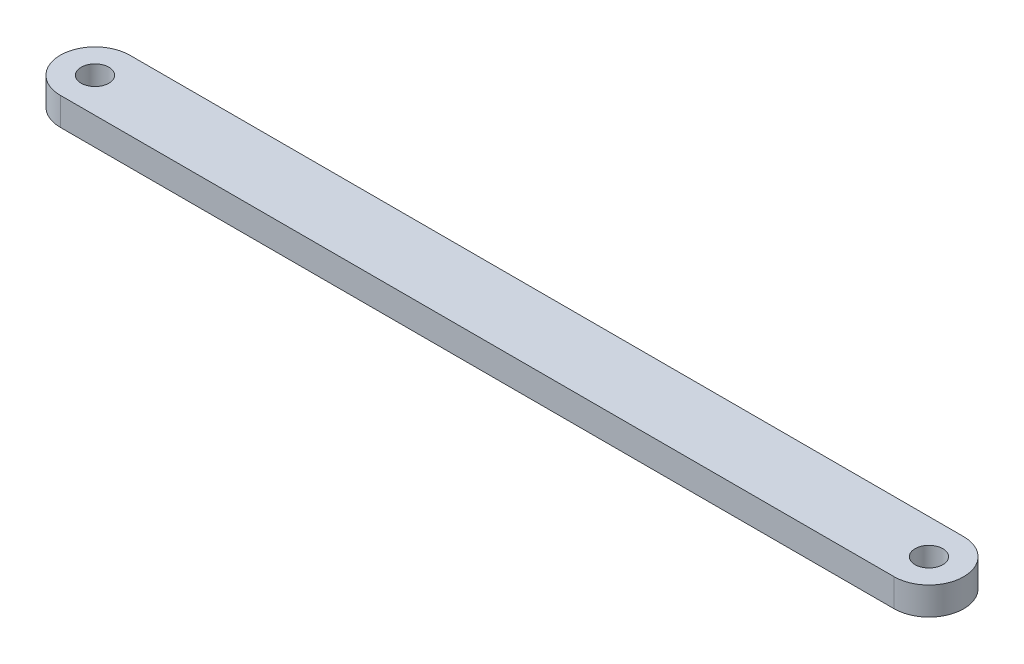
ISO-10303-21;
HEADER;
FILE_DESCRIPTION(('STEP AP214'),'2;1');
FILE_NAME('part.step','',(''),(''),'','','');
FILE_SCHEMA(('AUTOMOTIVE_DESIGN { 1 0 10303 214 1 1 1 1 }'));
ENDSEC;
DATA;
#1=APPLICATION_CONTEXT('core data for automotive mechanical design processes');
#2=APPLICATION_PROTOCOL_DEFINITION('international standard','automotive_design',2000,#1);
#3=PRODUCT_CONTEXT('',#1,'mechanical');
#4=PRODUCT('Part','Part','',(#3));
#5=PRODUCT_RELATED_PRODUCT_CATEGORY('part','',(#4));
#6=PRODUCT_DEFINITION_FORMATION('','',#4);
#7=PRODUCT_DEFINITION_CONTEXT('part definition',#1,'design');
#8=PRODUCT_DEFINITION('design','',#6,#7);
#9=PRODUCT_DEFINITION_SHAPE('','',#8);
#10=(LENGTH_UNIT() NAMED_UNIT(*) SI_UNIT(.MILLI.,.METRE.));
#11=(NAMED_UNIT(*) PLANE_ANGLE_UNIT() SI_UNIT($,.RADIAN.));
#12=(NAMED_UNIT(*) SI_UNIT($,.STERADIAN.) SOLID_ANGLE_UNIT());
#13=UNCERTAINTY_MEASURE_WITH_UNIT(LENGTH_MEASURE(1.E-05),#10,'distance_accuracy_value','');
#14=(GEOMETRIC_REPRESENTATION_CONTEXT(3) GLOBAL_UNCERTAINTY_ASSIGNED_CONTEXT((#13)) GLOBAL_UNIT_ASSIGNED_CONTEXT((#10,
#11,#12)) REPRESENTATION_CONTEXT('',''));
#15=CARTESIAN_POINT('',(0.,0.,0.));
#16=DIRECTION('',(0.,0.,1.));
#17=DIRECTION('',(1.,0.,0.));
#18=AXIS2_PLACEMENT_3D('',#15,#16,#17);
#19=CARTESIAN_POINT('',(-10.,2.,0.));
#20=DIRECTION('',(0.,1.,0.));
#21=DIRECTION('',(0.,0.,1.));
#22=AXIS2_PLACEMENT_3D('',#19,#20,#21);
#23=PLANE('',#22);
#24=CARTESIAN_POINT('',(50.,2.,0.));
#25=DIRECTION('',(0.,1.,0.));
#26=DIRECTION('',(0.,0.,1.));
#27=AXIS2_PLACEMENT_3D('',#24,#25,#26);
#28=CIRCLE('',#27,0.999999999999998);
#29=CARTESIAN_POINT('',(50.,2.,0.999999999999998));
#30=VERTEX_POINT('',#29);
#31=EDGE_CURVE('E104',#30,#30,#28,.T.);
#32=ORIENTED_EDGE('',*,*,#31,.F.);
#33=EDGE_LOOP('',(#32));
#34=FACE_BOUND('',#33,.T.);
#35=CARTESIAN_POINT('',(-10.,2.,0.));
#36=DIRECTION('',(0.,1.,0.));
#37=DIRECTION('',(0.,0.,1.));
#38=AXIS2_PLACEMENT_3D('',#35,#36,#37);
#39=CIRCLE('',#38,2.5);
#40=CARTESIAN_POINT('',(-10.,2.,-2.5));
#41=VERTEX_POINT('',#40);
#42=CARTESIAN_POINT('',(-10.,2.,2.5));
#43=VERTEX_POINT('',#42);
#44=EDGE_CURVE('E89',#41,#43,#39,.T.);
#45=ORIENTED_EDGE('',*,*,#44,.T.);
#46=DIRECTION('',(1.,0.,0.));
#47=VECTOR('',#46,1.);
#48=CARTESIAN_POINT('',(-10.,2.,2.5));
#49=LINE('',#48,#47);
#50=CARTESIAN_POINT('',(50.,2.,2.5));
#51=VERTEX_POINT('',#50);
#52=EDGE_CURVE('E84',#43,#51,#49,.T.);
#53=ORIENTED_EDGE('',*,*,#52,.T.);
#54=CARTESIAN_POINT('',(50.,2.,0.));
#55=DIRECTION('',(0.,1.,0.));
#56=DIRECTION('',(0.,0.,1.));
#57=AXIS2_PLACEMENT_3D('',#54,#55,#56);
#58=CIRCLE('',#57,2.5);
#59=CARTESIAN_POINT('',(50.,2.,-2.5));
#60=VERTEX_POINT('',#59);
#61=EDGE_CURVE('E87',#51,#60,#58,.T.);
#62=ORIENTED_EDGE('',*,*,#61,.T.);
#63=DIRECTION('',(-1.,0.,0.));
#64=VECTOR('',#63,1.);
#65=CARTESIAN_POINT('',(-10.,2.,-2.5));
#66=LINE('',#65,#64);
#67=EDGE_CURVE('E54',#60,#41,#66,.T.);
#68=ORIENTED_EDGE('',*,*,#67,.T.);
#69=EDGE_LOOP('',(#45,#53,#62,#68));
#70=FACE_BOUND('',#69,.T.);
#71=CARTESIAN_POINT('',(-10.,2.,0.));
#72=DIRECTION('',(0.,1.,0.));
#73=DIRECTION('',(0.,0.,1.));
#74=AXIS2_PLACEMENT_3D('',#71,#72,#73);
#75=CIRCLE('',#74,1.);
#76=CARTESIAN_POINT('',(-10.,2.,1.));
#77=VERTEX_POINT('',#76);
#78=EDGE_CURVE('E119',#77,#77,#75,.T.);
#79=ORIENTED_EDGE('',*,*,#78,.F.);
#80=EDGE_LOOP('',(#79));
#81=FACE_BOUND('',#80,.T.);
#82=ADVANCED_FACE('F37',(#34,#70,#81),#23,.T.);
#83=CARTESIAN_POINT('',(-10.,0.,0.));
#84=DIRECTION('',(0.,1.,0.));
#85=DIRECTION('',(0.,0.,1.));
#86=AXIS2_PLACEMENT_3D('',#83,#84,#85);
#87=PLANE('',#86);
#88=CARTESIAN_POINT('',(-10.,0.,0.));
#89=DIRECTION('',(0.,1.,0.));
#90=DIRECTION('',(0.,0.,1.));
#91=AXIS2_PLACEMENT_3D('',#88,#89,#90);
#92=CIRCLE('',#91,2.5);
#93=CARTESIAN_POINT('',(-10.,0.,-2.5));
#94=VERTEX_POINT('',#93);
#95=CARTESIAN_POINT('',(-10.,0.,2.5));
#96=VERTEX_POINT('',#95);
#97=EDGE_CURVE('E101',#94,#96,#92,.T.);
#98=ORIENTED_EDGE('',*,*,#97,.F.);
#99=DIRECTION('',(-1.,0.,0.));
#100=VECTOR('',#99,1.);
#101=CARTESIAN_POINT('',(-10.,0.,-2.5));
#102=LINE('',#101,#100);
#103=CARTESIAN_POINT('',(50.,0.,-2.5));
#104=VERTEX_POINT('',#103);
#105=EDGE_CURVE('E77',#104,#94,#102,.T.);
#106=ORIENTED_EDGE('',*,*,#105,.F.);
#107=CARTESIAN_POINT('',(50.,0.,0.));
#108=DIRECTION('',(0.,1.,0.));
#109=DIRECTION('',(0.,0.,1.));
#110=AXIS2_PLACEMENT_3D('',#107,#108,#109);
#111=CIRCLE('',#110,2.5);
#112=CARTESIAN_POINT('',(50.,0.,2.5));
#113=VERTEX_POINT('',#112);
#114=EDGE_CURVE('E71',#113,#104,#111,.T.);
#115=ORIENTED_EDGE('',*,*,#114,.F.);
#116=DIRECTION('',(1.,0.,0.));
#117=VECTOR('',#116,1.);
#118=CARTESIAN_POINT('',(-10.,0.,2.5));
#119=LINE('',#118,#117);
#120=EDGE_CURVE('E93',#96,#113,#119,.T.);
#121=ORIENTED_EDGE('',*,*,#120,.F.);
#122=EDGE_LOOP('',(#98,#106,#115,#121));
#123=FACE_BOUND('',#122,.T.);
#124=CARTESIAN_POINT('',(50.,0.,0.));
#125=DIRECTION('',(0.,1.,0.));
#126=DIRECTION('',(0.,0.,1.));
#127=AXIS2_PLACEMENT_3D('',#124,#125,#126);
#128=CIRCLE('',#127,0.999999999999998);
#129=CARTESIAN_POINT('',(50.,0.,0.999999999999998));
#130=VERTEX_POINT('',#129);
#131=EDGE_CURVE('E116',#130,#130,#128,.T.);
#132=ORIENTED_EDGE('',*,*,#131,.T.);
#133=EDGE_LOOP('',(#132));
#134=FACE_BOUND('',#133,.T.);
#135=CARTESIAN_POINT('',(-10.,0.,0.));
#136=DIRECTION('',(0.,1.,0.));
#137=DIRECTION('',(0.,0.,1.));
#138=AXIS2_PLACEMENT_3D('',#135,#136,#137);
#139=CIRCLE('',#138,1.);
#140=CARTESIAN_POINT('',(-10.,0.,1.));
#141=VERTEX_POINT('',#140);
#142=EDGE_CURVE('E122',#141,#141,#139,.T.);
#143=ORIENTED_EDGE('',*,*,#142,.T.);
#144=EDGE_LOOP('',(#143));
#145=FACE_BOUND('',#144,.T.);
#146=ADVANCED_FACE('F112',(#123,#134,#145),#87,.F.);
#147=CARTESIAN_POINT('',(-10.,2.,0.));
#148=DIRECTION('',(0.,-1.,0.));
#149=DIRECTION('',(0.,0.,-1.));
#150=AXIS2_PLACEMENT_3D('',#147,#148,#149);
#151=CYLINDRICAL_SURFACE('',#150,2.5);
#152=ORIENTED_EDGE('',*,*,#97,.T.);
#153=DIRECTION('',(0.,-1.,0.));
#154=VECTOR('',#153,1.);
#155=CARTESIAN_POINT('',(-10.,2.,2.5));
#156=LINE('',#155,#154);
#157=EDGE_CURVE('E11',#43,#96,#156,.T.);
#158=ORIENTED_EDGE('',*,*,#157,.F.);
#159=ORIENTED_EDGE('',*,*,#44,.F.);
#160=DIRECTION('',(0.,-1.,0.));
#161=VECTOR('',#160,1.);
#162=CARTESIAN_POINT('',(-10.,2.,-2.5));
#163=LINE('',#162,#161);
#164=EDGE_CURVE('E97',#41,#94,#163,.T.);
#165=ORIENTED_EDGE('',*,*,#164,.T.);
#166=EDGE_LOOP('',(#152,#158,#159,#165));
#167=FACE_BOUND('',#166,.T.);
#168=ADVANCED_FACE('F39',(#167),#151,.T.);
#169=CARTESIAN_POINT('',(-10.,2.,2.5));
#170=DIRECTION('',(0.,0.,-1.));
#171=DIRECTION('',(-1.,0.,0.));
#172=AXIS2_PLACEMENT_3D('',#169,#170,#171);
#173=PLANE('',#172);
#174=ORIENTED_EDGE('',*,*,#120,.T.);
#175=DIRECTION('',(0.,-1.,0.));
#176=VECTOR('',#175,1.);
#177=CARTESIAN_POINT('',(50.,2.,2.5));
#178=LINE('',#177,#176);
#179=EDGE_CURVE('E46',#51,#113,#178,.T.);
#180=ORIENTED_EDGE('',*,*,#179,.F.);
#181=ORIENTED_EDGE('',*,*,#52,.F.);
#182=ORIENTED_EDGE('',*,*,#157,.T.);
#183=EDGE_LOOP('',(#174,#180,#181,#182));
#184=FACE_BOUND('',#183,.T.);
#185=ADVANCED_FACE('F92',(#184),#173,.F.);
#186=CARTESIAN_POINT('',(50.,2.,0.));
#187=DIRECTION('',(0.,-1.,0.));
#188=DIRECTION('',(0.,0.,-1.));
#189=AXIS2_PLACEMENT_3D('',#186,#187,#188);
#190=CYLINDRICAL_SURFACE('',#189,2.5);
#191=ORIENTED_EDGE('',*,*,#114,.T.);
#192=DIRECTION('',(0.,-1.,0.));
#193=VECTOR('',#192,1.);
#194=CARTESIAN_POINT('',(50.,2.,-2.5));
#195=LINE('',#194,#193);
#196=EDGE_CURVE('E94',#60,#104,#195,.T.);
#197=ORIENTED_EDGE('',*,*,#196,.F.);
#198=ORIENTED_EDGE('',*,*,#61,.F.);
#199=ORIENTED_EDGE('',*,*,#179,.T.);
#200=EDGE_LOOP('',(#191,#197,#198,#199));
#201=FACE_BOUND('',#200,.T.);
#202=ADVANCED_FACE('F95',(#201),#190,.T.);
#203=CARTESIAN_POINT('',(-10.,2.,-2.5));
#204=DIRECTION('',(0.,0.,1.));
#205=DIRECTION('',(1.,0.,0.));
#206=AXIS2_PLACEMENT_3D('',#203,#204,#205);
#207=PLANE('',#206);
#208=ORIENTED_EDGE('',*,*,#105,.T.);
#209=ORIENTED_EDGE('',*,*,#164,.F.);
#210=ORIENTED_EDGE('',*,*,#67,.F.);
#211=ORIENTED_EDGE('',*,*,#196,.T.);
#212=EDGE_LOOP('',(#208,#209,#210,#211));
#213=FACE_BOUND('',#212,.T.);
#214=ADVANCED_FACE('F109',(#213),#207,.F.);
#215=CARTESIAN_POINT('',(50.,2.,0.));
#216=DIRECTION('',(0.,-1.,0.));
#217=DIRECTION('',(0.,0.,-1.));
#218=AXIS2_PLACEMENT_3D('',#215,#216,#217);
#219=CYLINDRICAL_SURFACE('',#218,0.999999999999998);
#220=ORIENTED_EDGE('',*,*,#31,.T.);
#221=EDGE_LOOP('',(#220));
#222=FACE_BOUND('',#221,.T.);
#223=ORIENTED_EDGE('',*,*,#131,.F.);
#224=EDGE_LOOP('',(#223));
#225=FACE_BOUND('',#224,.T.);
#226=ADVANCED_FACE('F139',(#222,#225),#219,.F.);
#227=CARTESIAN_POINT('',(-10.,2.,0.));
#228=DIRECTION('',(0.,-1.,0.));
#229=DIRECTION('',(0.,0.,-1.));
#230=AXIS2_PLACEMENT_3D('',#227,#228,#229);
#231=CYLINDRICAL_SURFACE('',#230,1.);
#232=ORIENTED_EDGE('',*,*,#78,.T.);
#233=EDGE_LOOP('',(#232));
#234=FACE_BOUND('',#233,.T.);
#235=ORIENTED_EDGE('',*,*,#142,.F.);
#236=EDGE_LOOP('',(#235));
#237=FACE_BOUND('',#236,.T.);
#238=ADVANCED_FACE('F128',(#234,#237),#231,.F.);
#239=CLOSED_SHELL('',(#82,#146,#168,#185,#202,#214,#226,#238));
#240=MANIFOLD_SOLID_BREP('B2',#239);
#241=ADVANCED_BREP_SHAPE_REPRESENTATION('',(#18,#240),#14);
#242=SHAPE_DEFINITION_REPRESENTATION(#9,#241);
ENDSEC;
END-ISO-10303-21;
